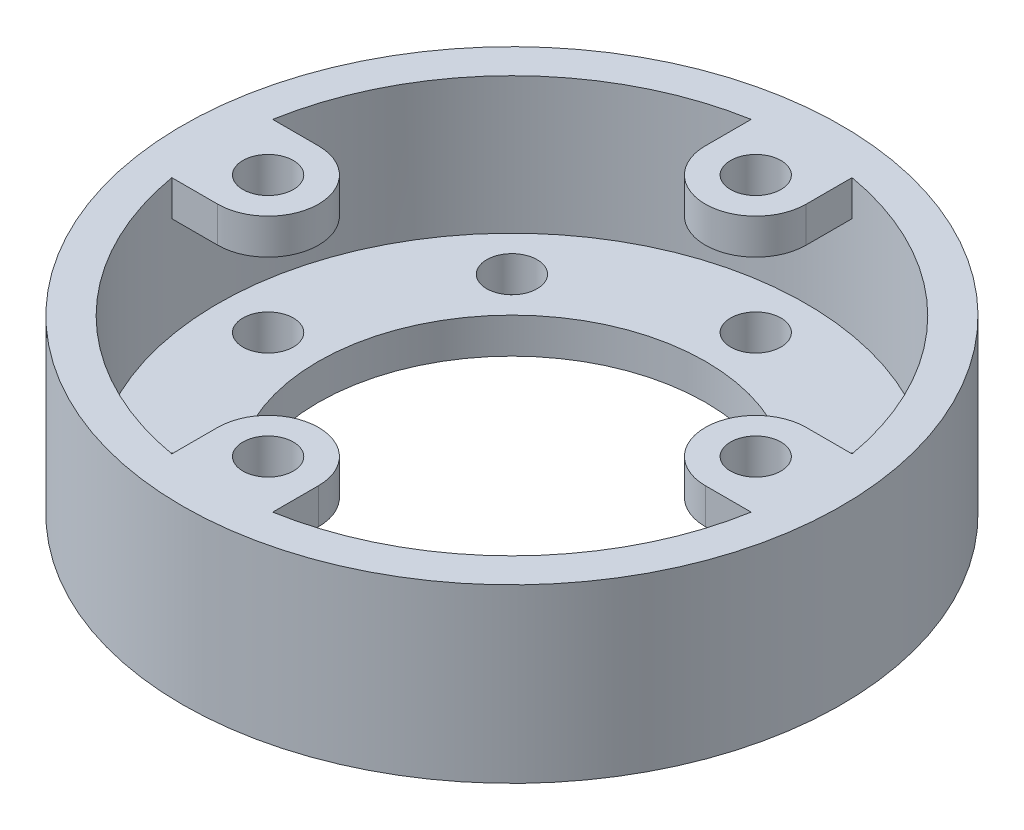
ISO-10303-21;
HEADER;
FILE_DESCRIPTION(('STEP AP214'),'2;1');
FILE_NAME('part.step','',(''),(''),'','','');
FILE_SCHEMA(('AUTOMOTIVE_DESIGN { 1 0 10303 214 1 1 1 1 }'));
ENDSEC;
DATA;
#1=APPLICATION_CONTEXT('core data for automotive mechanical design processes');
#2=APPLICATION_PROTOCOL_DEFINITION('international standard','automotive_design',2000,#1);
#3=PRODUCT_CONTEXT('',#1,'mechanical');
#4=PRODUCT('Part','Part','',(#3));
#5=PRODUCT_RELATED_PRODUCT_CATEGORY('part','',(#4));
#6=PRODUCT_DEFINITION_FORMATION('','',#4);
#7=PRODUCT_DEFINITION_CONTEXT('part definition',#1,'design');
#8=PRODUCT_DEFINITION('design','',#6,#7);
#9=PRODUCT_DEFINITION_SHAPE('','',#8);
#10=(LENGTH_UNIT() NAMED_UNIT(*) SI_UNIT(.MILLI.,.METRE.));
#11=(NAMED_UNIT(*) PLANE_ANGLE_UNIT() SI_UNIT($,.RADIAN.));
#12=(NAMED_UNIT(*) SI_UNIT($,.STERADIAN.) SOLID_ANGLE_UNIT());
#13=UNCERTAINTY_MEASURE_WITH_UNIT(LENGTH_MEASURE(1.E-05),#10,'distance_accuracy_value','');
#14=(GEOMETRIC_REPRESENTATION_CONTEXT(3) GLOBAL_UNCERTAINTY_ASSIGNED_CONTEXT((#13)) GLOBAL_UNIT_ASSIGNED_CONTEXT((#10,
#11,#12)) REPRESENTATION_CONTEXT('',''));
#15=CARTESIAN_POINT('',(0.,0.,0.));
#16=DIRECTION('',(0.,0.,1.));
#17=DIRECTION('',(1.,0.,0.));
#18=AXIS2_PLACEMENT_3D('',#15,#16,#17);
#19=CARTESIAN_POINT('',(0.,7.874,0.));
#20=DIRECTION('',(0.,1.,0.));
#21=DIRECTION('',(0.,0.,1.));
#22=AXIS2_PLACEMENT_3D('',#19,#20,#21);
#23=PLANE('',#22);
#24=CARTESIAN_POINT('',(-54.025277322763,7.874,0.));
#25=DIRECTION('',(0.,1.,0.));
#26=DIRECTION('',(0.,0.,1.));
#27=AXIS2_PLACEMENT_3D('',#24,#25,#26);
#28=CIRCLE('',#27,5.588);
#29=CARTESIAN_POINT('',(-54.025277322763,7.874,5.588));
#30=VERTEX_POINT('',#29);
#31=EDGE_CURVE('E338',#30,#30,#28,.T.);
#32=ORIENTED_EDGE('',*,*,#31,.F.);
#33=EDGE_LOOP('',(#32));
#34=FACE_BOUND('',#33,.T.);
#35=CARTESIAN_POINT('',(-38.2016399504095,7.874,-38.2016399504096));
#36=DIRECTION('',(0.,1.,0.));
#37=DIRECTION('',(0.,0.,1.));
#38=AXIS2_PLACEMENT_3D('',#35,#36,#37);
#39=CIRCLE('',#38,5.58799999999998);
#40=CARTESIAN_POINT('',(-38.2016399504095,7.874,-32.6136399504097));
#41=VERTEX_POINT('',#40);
#42=EDGE_CURVE('E342',#41,#41,#39,.T.);
#43=ORIENTED_EDGE('',*,*,#42,.F.);
#44=EDGE_LOOP('',(#43));
#45=FACE_BOUND('',#44,.T.);
#46=CARTESIAN_POINT('',(1.51354623278976E-13,7.874,-54.025277322763));
#47=DIRECTION('',(0.,1.,0.));
#48=DIRECTION('',(0.,0.,1.));
#49=AXIS2_PLACEMENT_3D('',#46,#47,#48);
#50=CIRCLE('',#49,5.588);
#51=CARTESIAN_POINT('',(1.51354623278976E-13,7.874,-48.437277322763));
#52=VERTEX_POINT('',#51);
#53=EDGE_CURVE('E346',#52,#52,#50,.T.);
#54=ORIENTED_EDGE('',*,*,#53,.F.);
#55=EDGE_LOOP('',(#54));
#56=FACE_BOUND('',#55,.T.);
#57=CARTESIAN_POINT('',(38.2016399504097,7.874,-38.2016399504094));
#58=DIRECTION('',(0.,1.,0.));
#59=DIRECTION('',(0.,0.,1.));
#60=AXIS2_PLACEMENT_3D('',#57,#58,#59);
#61=CIRCLE('',#60,5.588);
#62=CARTESIAN_POINT('',(38.2016399504097,7.874,-32.6136399504094));
#63=VERTEX_POINT('',#62);
#64=EDGE_CURVE('E350',#63,#63,#61,.T.);
#65=ORIENTED_EDGE('',*,*,#64,.F.);
#66=EDGE_LOOP('',(#65));
#67=FACE_BOUND('',#66,.T.);
#68=CARTESIAN_POINT('',(54.0252773227631,7.874,2.80157841370254E-13));
#69=DIRECTION('',(0.,1.,0.));
#70=DIRECTION('',(0.,0.,1.));
#71=AXIS2_PLACEMENT_3D('',#68,#69,#70);
#72=CIRCLE('',#71,5.588);
#73=CARTESIAN_POINT('',(54.0252773227631,7.874,5.58800000000028));
#74=VERTEX_POINT('',#73);
#75=EDGE_CURVE('E354',#74,#74,#72,.T.);
#76=ORIENTED_EDGE('',*,*,#75,.F.);
#77=EDGE_LOOP('',(#76));
#78=FACE_BOUND('',#77,.T.);
#79=CARTESIAN_POINT('',(38.2016399504093,7.874,38.2016399504098));
#80=DIRECTION('',(0.,1.,0.));
#81=DIRECTION('',(0.,0.,1.));
#82=AXIS2_PLACEMENT_3D('',#79,#80,#81);
#83=CIRCLE('',#82,5.588);
#84=CARTESIAN_POINT('',(38.2016399504093,7.874,43.7896399504098));
#85=VERTEX_POINT('',#84);
#86=EDGE_CURVE('E358',#85,#85,#83,.T.);
#87=ORIENTED_EDGE('',*,*,#86,.F.);
#88=EDGE_LOOP('',(#87));
#89=FACE_BOUND('',#88,.T.);
#90=CARTESIAN_POINT('',(-4.09828421199521E-13,7.874,54.025277322763));
#91=DIRECTION('',(0.,1.,0.));
#92=DIRECTION('',(0.,0.,1.));
#93=AXIS2_PLACEMENT_3D('',#90,#91,#92);
#94=CIRCLE('',#93,5.588);
#95=CARTESIAN_POINT('',(-4.09828421199521E-13,7.874,59.613277322763));
#96=VERTEX_POINT('',#95);
#97=EDGE_CURVE('E362',#96,#96,#94,.T.);
#98=ORIENTED_EDGE('',*,*,#97,.F.);
#99=EDGE_LOOP('',(#98));
#100=FACE_BOUND('',#99,.T.);
#101=CARTESIAN_POINT('',(-38.2016399504099,7.874,38.2016399504092));
#102=DIRECTION('',(0.,1.,0.));
#103=DIRECTION('',(0.,0.,1.));
#104=AXIS2_PLACEMENT_3D('',#101,#102,#103);
#105=CIRCLE('',#104,5.58800000000001);
#106=CARTESIAN_POINT('',(-38.2016399504099,7.874,43.7896399504092));
#107=VERTEX_POINT('',#106);
#108=EDGE_CURVE('E366',#107,#107,#105,.T.);
#109=ORIENTED_EDGE('',*,*,#108,.F.);
#110=EDGE_LOOP('',(#109));
#111=FACE_BOUND('',#110,.T.);
#112=CARTESIAN_POINT('',(0.,7.874,0.));
#113=DIRECTION('',(0.,1.,0.));
#114=DIRECTION('',(0.,0.,1.));
#115=AXIS2_PLACEMENT_3D('',#112,#113,#114);
#116=CIRCLE('',#115,42.926);
#117=CARTESIAN_POINT('',(0.,7.874,42.926));
#118=VERTEX_POINT('',#117);
#119=EDGE_CURVE('E303',#118,#118,#116,.T.);
#120=ORIENTED_EDGE('',*,*,#119,.F.);
#121=EDGE_LOOP('',(#120));
#122=FACE_BOUND('',#121,.T.);
#123=CARTESIAN_POINT('',(0.,7.874,0.));
#124=DIRECTION('',(0.,1.,0.));
#125=DIRECTION('',(0.,0.,1.));
#126=AXIS2_PLACEMENT_3D('',#123,#124,#125);
#127=CIRCLE('',#126,65.151);
#128=CARTESIAN_POINT('',(0.,7.874,65.151));
#129=VERTEX_POINT('',#128);
#130=EDGE_CURVE('E11',#129,#129,#127,.F.);
#131=ORIENTED_EDGE('',*,*,#130,.F.);
#132=EDGE_LOOP('',(#131));
#133=FACE_BOUND('',#132,.T.);
#134=ADVANCED_FACE('F35',(#34,#45,#56,#67,#78,#89,#100,#111,#122,#133),#23,.T.);
#135=CARTESIAN_POINT('',(0.,0.,0.));
#136=DIRECTION('',(0.,1.,0.));
#137=DIRECTION('',(0.,0.,1.));
#138=AXIS2_PLACEMENT_3D('',#135,#136,#137);
#139=PLANE('',#138);
#140=CARTESIAN_POINT('',(-54.025277322763,0.,0.));
#141=DIRECTION('',(0.,1.,0.));
#142=DIRECTION('',(0.,0.,1.));
#143=AXIS2_PLACEMENT_3D('',#140,#141,#142);
#144=CIRCLE('',#143,5.588);
#145=CARTESIAN_POINT('',(-54.025277322763,0.,5.588));
#146=VERTEX_POINT('',#145);
#147=EDGE_CURVE('E181',#146,#146,#144,.T.);
#148=ORIENTED_EDGE('',*,*,#147,.T.);
#149=EDGE_LOOP('',(#148));
#150=FACE_BOUND('',#149,.T.);
#151=CARTESIAN_POINT('',(-38.2016399504095,0.,-38.2016399504096));
#152=DIRECTION('',(0.,1.,0.));
#153=DIRECTION('',(0.,0.,1.));
#154=AXIS2_PLACEMENT_3D('',#151,#152,#153);
#155=CIRCLE('',#154,5.58799999999998);
#156=CARTESIAN_POINT('',(-38.2016399504095,0.,-32.6136399504097));
#157=VERTEX_POINT('',#156);
#158=EDGE_CURVE('E487',#157,#157,#155,.T.);
#159=ORIENTED_EDGE('',*,*,#158,.T.);
#160=EDGE_LOOP('',(#159));
#161=FACE_BOUND('',#160,.T.);
#162=CARTESIAN_POINT('',(1.51354623278976E-13,0.,-54.025277322763));
#163=DIRECTION('',(0.,1.,0.));
#164=DIRECTION('',(0.,0.,1.));
#165=AXIS2_PLACEMENT_3D('',#162,#163,#164);
#166=CIRCLE('',#165,5.588);
#167=CARTESIAN_POINT('',(1.51354623278976E-13,0.,-48.437277322763));
#168=VERTEX_POINT('',#167);
#169=EDGE_CURVE('E494',#168,#168,#166,.T.);
#170=ORIENTED_EDGE('',*,*,#169,.T.);
#171=EDGE_LOOP('',(#170));
#172=FACE_BOUND('',#171,.T.);
#173=CARTESIAN_POINT('',(38.2016399504097,0.,-38.2016399504094));
#174=DIRECTION('',(0.,1.,0.));
#175=DIRECTION('',(0.,0.,1.));
#176=AXIS2_PLACEMENT_3D('',#173,#174,#175);
#177=CIRCLE('',#176,5.588);
#178=CARTESIAN_POINT('',(38.2016399504097,0.,-32.6136399504094));
#179=VERTEX_POINT('',#178);
#180=EDGE_CURVE('E498',#179,#179,#177,.T.);
#181=ORIENTED_EDGE('',*,*,#180,.T.);
#182=EDGE_LOOP('',(#181));
#183=FACE_BOUND('',#182,.T.);
#184=CARTESIAN_POINT('',(54.0252773227631,0.,2.80157841370254E-13));
#185=DIRECTION('',(0.,1.,0.));
#186=DIRECTION('',(0.,0.,1.));
#187=AXIS2_PLACEMENT_3D('',#184,#185,#186);
#188=CIRCLE('',#187,5.588);
#189=CARTESIAN_POINT('',(54.0252773227631,0.,5.58800000000028));
#190=VERTEX_POINT('',#189);
#191=EDGE_CURVE('E502',#190,#190,#188,.T.);
#192=ORIENTED_EDGE('',*,*,#191,.T.);
#193=EDGE_LOOP('',(#192));
#194=FACE_BOUND('',#193,.T.);
#195=CARTESIAN_POINT('',(38.2016399504093,0.,38.2016399504098));
#196=DIRECTION('',(0.,1.,0.));
#197=DIRECTION('',(0.,0.,1.));
#198=AXIS2_PLACEMENT_3D('',#195,#196,#197);
#199=CIRCLE('',#198,5.588);
#200=CARTESIAN_POINT('',(38.2016399504093,0.,43.7896399504098));
#201=VERTEX_POINT('',#200);
#202=EDGE_CURVE('E506',#201,#201,#199,.T.);
#203=ORIENTED_EDGE('',*,*,#202,.T.);
#204=EDGE_LOOP('',(#203));
#205=FACE_BOUND('',#204,.T.);
#206=CARTESIAN_POINT('',(-4.09828421199521E-13,0.,54.025277322763));
#207=DIRECTION('',(0.,1.,0.));
#208=DIRECTION('',(0.,0.,1.));
#209=AXIS2_PLACEMENT_3D('',#206,#207,#208);
#210=CIRCLE('',#209,5.588);
#211=CARTESIAN_POINT('',(-4.09828421199521E-13,0.,59.613277322763));
#212=VERTEX_POINT('',#211);
#213=EDGE_CURVE('E510',#212,#212,#210,.T.);
#214=ORIENTED_EDGE('',*,*,#213,.T.);
#215=EDGE_LOOP('',(#214));
#216=FACE_BOUND('',#215,.T.);
#217=CARTESIAN_POINT('',(-38.2016399504099,0.,38.2016399504092));
#218=DIRECTION('',(0.,1.,0.));
#219=DIRECTION('',(0.,0.,1.));
#220=AXIS2_PLACEMENT_3D('',#217,#218,#219);
#221=CIRCLE('',#220,5.58800000000001);
#222=CARTESIAN_POINT('',(-38.2016399504099,0.,43.7896399504092));
#223=VERTEX_POINT('',#222);
#224=EDGE_CURVE('E514',#223,#223,#221,.T.);
#225=ORIENTED_EDGE('',*,*,#224,.T.);
#226=EDGE_LOOP('',(#225));
#227=FACE_BOUND('',#226,.T.);
#228=CARTESIAN_POINT('',(0.,0.,0.));
#229=DIRECTION('',(0.,1.,0.));
#230=DIRECTION('',(0.,0.,1.));
#231=AXIS2_PLACEMENT_3D('',#228,#229,#230);
#232=CIRCLE('',#231,73.025);
#233=CARTESIAN_POINT('',(0.,0.,73.025));
#234=VERTEX_POINT('',#233);
#235=EDGE_CURVE('E43',#234,#234,#232,.T.);
#236=ORIENTED_EDGE('',*,*,#235,.F.);
#237=EDGE_LOOP('',(#236));
#238=FACE_BOUND('',#237,.T.);
#239=CARTESIAN_POINT('',(0.,0.,0.));
#240=DIRECTION('',(0.,1.,0.));
#241=DIRECTION('',(0.,0.,1.));
#242=AXIS2_PLACEMENT_3D('',#239,#240,#241);
#243=CIRCLE('',#242,42.926);
#244=CARTESIAN_POINT('',(0.,0.,42.926));
#245=VERTEX_POINT('',#244);
#246=EDGE_CURVE('E302',#245,#245,#243,.T.);
#247=ORIENTED_EDGE('',*,*,#246,.T.);
#248=EDGE_LOOP('',(#247));
#249=FACE_BOUND('',#248,.T.);
#250=ADVANCED_FACE('F312',(#150,#161,#172,#183,#194,#205,#216,#227,#238,#249),#139,.F.);
#251=CARTESIAN_POINT('',(0.,7.874,0.));
#252=DIRECTION('',(0.,-1.,0.));
#253=DIRECTION('',(0.,0.,-1.));
#254=AXIS2_PLACEMENT_3D('',#251,#252,#253);
#255=CYLINDRICAL_SURFACE('',#254,73.025);
#256=ORIENTED_EDGE('',*,*,#235,.T.);
#257=EDGE_LOOP('',(#256));
#258=FACE_BOUND('',#257,.T.);
#259=CARTESIAN_POINT('',(0.,38.1,0.));
#260=DIRECTION('',(0.,1.,0.));
#261=DIRECTION('',(0.,0.,1.));
#262=AXIS2_PLACEMENT_3D('',#259,#260,#261);
#263=CIRCLE('',#262,73.025);
#264=CARTESIAN_POINT('',(0.,38.1,73.025));
#265=VERTEX_POINT('',#264);
#266=EDGE_CURVE('E298',#265,#265,#263,.T.);
#267=ORIENTED_EDGE('',*,*,#266,.F.);
#268=EDGE_LOOP('',(#267));
#269=FACE_BOUND('',#268,.T.);
#270=ADVANCED_FACE('F37',(#258,#269),#255,.T.);
#271=CARTESIAN_POINT('',(0.,7.874,0.));
#272=DIRECTION('',(0.,-1.,0.));
#273=DIRECTION('',(0.,0.,-1.));
#274=AXIS2_PLACEMENT_3D('',#271,#272,#273);
#275=CYLINDRICAL_SURFACE('',#274,42.926);
#276=ORIENTED_EDGE('',*,*,#119,.T.);
#277=EDGE_LOOP('',(#276));
#278=FACE_BOUND('',#277,.T.);
#279=ORIENTED_EDGE('',*,*,#246,.F.);
#280=EDGE_LOOP('',(#279));
#281=FACE_BOUND('',#280,.T.);
#282=ADVANCED_FACE('F318',(#278,#281),#275,.F.);
#283=CARTESIAN_POINT('',(0.,38.1,0.));
#284=DIRECTION('',(0.,1.,0.));
#285=DIRECTION('',(0.,0.,1.));
#286=AXIS2_PLACEMENT_3D('',#283,#284,#285);
#287=PLANE('',#286);
#288=ORIENTED_EDGE('',*,*,#266,.T.);
#289=EDGE_LOOP('',(#288));
#290=FACE_BOUND('',#289,.T.);
#291=CARTESIAN_POINT('',(0.,38.1,0.));
#292=DIRECTION('',(0.,1.,0.));
#293=DIRECTION('',(0.,0.,1.));
#294=AXIS2_PLACEMENT_3D('',#291,#292,#293);
#295=CIRCLE('',#294,65.151);
#296=CARTESIAN_POINT('',(-64.185277322763,38.1,11.176));
#297=VERTEX_POINT('',#296);
#298=CARTESIAN_POINT('',(-11.176,38.1,64.185277322763));
#299=VERTEX_POINT('',#298);
#300=EDGE_CURVE('E296',#297,#299,#295,.T.);
#301=ORIENTED_EDGE('',*,*,#300,.F.);
#302=DIRECTION('',(1.,0.,0.));
#303=VECTOR('',#302,1.);
#304=CARTESIAN_POINT('',(0.,38.1,11.176));
#305=LINE('',#304,#303);
#306=CARTESIAN_POINT('',(-54.025277322763,38.1,11.176));
#307=VERTEX_POINT('',#306);
#308=EDGE_CURVE('E265',#297,#307,#305,.T.);
#309=ORIENTED_EDGE('',*,*,#308,.T.);
#310=CARTESIAN_POINT('',(-54.025277322763,38.1,0.));
#311=DIRECTION('',(0.,1.,0.));
#312=DIRECTION('',(0.,0.,1.));
#313=AXIS2_PLACEMENT_3D('',#310,#311,#312);
#314=CIRCLE('',#313,11.176);
#315=CARTESIAN_POINT('',(-54.025277322763,38.1,-11.176));
#316=VERTEX_POINT('',#315);
#317=EDGE_CURVE('E278',#316,#307,#314,.F.);
#318=ORIENTED_EDGE('',*,*,#317,.F.);
#319=DIRECTION('',(1.,0.,0.));
#320=VECTOR('',#319,1.);
#321=CARTESIAN_POINT('',(0.,38.1,-11.176));
#322=LINE('',#321,#320);
#323=CARTESIAN_POINT('',(-64.185277322763,38.1,-11.176));
#324=VERTEX_POINT('',#323);
#325=EDGE_CURVE('E281',#324,#316,#322,.T.);
#326=ORIENTED_EDGE('',*,*,#325,.F.);
#327=CARTESIAN_POINT('',(-11.176,38.1,-64.185277322763));
#328=VERTEX_POINT('',#327);
#329=EDGE_CURVE('E287',#328,#324,#295,.T.);
#330=ORIENTED_EDGE('',*,*,#329,.F.);
#331=DIRECTION('',(0.,0.,1.));
#332=VECTOR('',#331,1.);
#333=CARTESIAN_POINT('',(-11.176,38.1,0.));
#334=LINE('',#333,#332);
#335=CARTESIAN_POINT('',(-11.176,38.1,-54.025277322763));
#336=VERTEX_POINT('',#335);
#337=EDGE_CURVE('E230',#328,#336,#334,.T.);
#338=ORIENTED_EDGE('',*,*,#337,.T.);
#339=CARTESIAN_POINT('',(0.,38.1,-54.025277322763));
#340=DIRECTION('',(0.,1.,0.));
#341=DIRECTION('',(0.,0.,1.));
#342=AXIS2_PLACEMENT_3D('',#339,#340,#341);
#343=CIRCLE('',#342,11.176);
#344=CARTESIAN_POINT('',(11.176,38.1,-54.025277322763));
#345=VERTEX_POINT('',#344);
#346=EDGE_CURVE('E243',#345,#336,#343,.F.);
#347=ORIENTED_EDGE('',*,*,#346,.F.);
#348=DIRECTION('',(0.,0.,1.));
#349=VECTOR('',#348,1.);
#350=CARTESIAN_POINT('',(11.176,38.1,0.));
#351=LINE('',#350,#349);
#352=CARTESIAN_POINT('',(11.176,38.1,-64.185277322763));
#353=VERTEX_POINT('',#352);
#354=EDGE_CURVE('E246',#353,#345,#351,.T.);
#355=ORIENTED_EDGE('',*,*,#354,.F.);
#356=CARTESIAN_POINT('',(64.1852773227628,38.1,-11.1760000000012));
#357=VERTEX_POINT('',#356);
#358=EDGE_CURVE('E757',#357,#353,#295,.T.);
#359=ORIENTED_EDGE('',*,*,#358,.F.);
#360=DIRECTION('',(-1.,0.,0.));
#361=VECTOR('',#360,1.);
#362=CARTESIAN_POINT('',(0.,38.1,-11.1760000000012));
#363=LINE('',#362,#361);
#364=CARTESIAN_POINT('',(54.0252773227619,38.1,-11.1760000000012));
#365=VERTEX_POINT('',#364);
#366=EDGE_CURVE('E195',#357,#365,#363,.T.);
#367=ORIENTED_EDGE('',*,*,#366,.T.);
#368=CARTESIAN_POINT('',(54.0252773227619,38.1,-1.20094063229014E-12));
#369=DIRECTION('',(0.,1.,0.));
#370=DIRECTION('',(0.,0.,1.));
#371=AXIS2_PLACEMENT_3D('',#368,#369,#370);
#372=CIRCLE('',#371,11.176);
#373=CARTESIAN_POINT('',(54.0252773227619,38.1,11.1759999999988));
#374=VERTEX_POINT('',#373);
#375=EDGE_CURVE('E208',#374,#365,#372,.F.);
#376=ORIENTED_EDGE('',*,*,#375,.F.);
#377=DIRECTION('',(-1.,0.,0.));
#378=VECTOR('',#377,1.);
#379=CARTESIAN_POINT('',(0.,38.1,11.1759999999988));
#380=LINE('',#379,#378);
#381=CARTESIAN_POINT('',(64.1852773227632,38.1,11.1759999999988));
#382=VERTEX_POINT('',#381);
#383=EDGE_CURVE('E211',#382,#374,#380,.T.);
#384=ORIENTED_EDGE('',*,*,#383,.F.);
#385=CARTESIAN_POINT('',(11.176,38.1,64.185277322763));
#386=VERTEX_POINT('',#385);
#387=EDGE_CURVE('E299',#386,#382,#295,.T.);
#388=ORIENTED_EDGE('',*,*,#387,.F.);
#389=DIRECTION('',(0.,0.,-1.));
#390=VECTOR('',#389,1.);
#391=CARTESIAN_POINT('',(11.176,38.1,0.));
#392=LINE('',#391,#390);
#393=CARTESIAN_POINT('',(11.176,38.1,54.025277322763));
#394=VERTEX_POINT('',#393);
#395=EDGE_CURVE('E171',#386,#394,#392,.T.);
#396=ORIENTED_EDGE('',*,*,#395,.T.);
#397=CARTESIAN_POINT('',(0.,38.1,54.025277322763));
#398=DIRECTION('',(0.,1.,0.));
#399=DIRECTION('',(0.,0.,1.));
#400=AXIS2_PLACEMENT_3D('',#397,#398,#399);
#401=CIRCLE('',#400,11.176);
#402=CARTESIAN_POINT('',(-11.176,38.1,54.025277322763));
#403=VERTEX_POINT('',#402);
#404=EDGE_CURVE('E180',#403,#394,#401,.F.);
#405=ORIENTED_EDGE('',*,*,#404,.F.);
#406=DIRECTION('',(0.,0.,-1.));
#407=VECTOR('',#406,1.);
#408=CARTESIAN_POINT('',(-11.176,38.1,0.));
#409=LINE('',#408,#407);
#410=EDGE_CURVE('E159',#299,#403,#409,.T.);
#411=ORIENTED_EDGE('',*,*,#410,.F.);
#412=EDGE_LOOP('',(#301,#309,#318,#326,#330,#338,#347,#355,#359,#367,#376,#384,#388,#396,#405,#411));
#413=FACE_BOUND('',#412,.T.);
#414=CARTESIAN_POINT('',(-54.025277322763,38.1,0.));
#415=DIRECTION('',(0.,1.,0.));
#416=DIRECTION('',(0.,0.,1.));
#417=AXIS2_PLACEMENT_3D('',#414,#415,#416);
#418=CIRCLE('',#417,5.588);
#419=CARTESIAN_POINT('',(-54.025277322763,38.1,5.588));
#420=VERTEX_POINT('',#419);
#421=EDGE_CURVE('E252',#420,#420,#418,.T.);
#422=ORIENTED_EDGE('',*,*,#421,.F.);
#423=EDGE_LOOP('',(#422));
#424=FACE_BOUND('',#423,.T.);
#425=CARTESIAN_POINT('',(0.,38.1,-54.025277322763));
#426=DIRECTION('',(0.,1.,0.));
#427=DIRECTION('',(0.,0.,1.));
#428=AXIS2_PLACEMENT_3D('',#425,#426,#427);
#429=CIRCLE('',#428,5.58800000000006);
#430=CARTESIAN_POINT('',(0.,38.1,-48.437277322763));
#431=VERTEX_POINT('',#430);
#432=EDGE_CURVE('E217',#431,#431,#429,.T.);
#433=ORIENTED_EDGE('',*,*,#432,.F.);
#434=EDGE_LOOP('',(#433));
#435=FACE_BOUND('',#434,.T.);
#436=CARTESIAN_POINT('',(54.0252773227619,38.1,-1.20094063229014E-12));
#437=DIRECTION('',(0.,1.,0.));
#438=DIRECTION('',(0.,0.,1.));
#439=AXIS2_PLACEMENT_3D('',#436,#437,#438);
#440=CIRCLE('',#439,5.58799999999934);
#441=CARTESIAN_POINT('',(54.0252773227619,38.1,5.58799999999813));
#442=VERTEX_POINT('',#441);
#443=EDGE_CURVE('E187',#442,#442,#440,.T.);
#444=ORIENTED_EDGE('',*,*,#443,.F.);
#445=EDGE_LOOP('',(#444));
#446=FACE_BOUND('',#445,.T.);
#447=CARTESIAN_POINT('',(0.,38.1,54.025277322763));
#448=DIRECTION('',(0.,1.,0.));
#449=DIRECTION('',(0.,0.,1.));
#450=AXIS2_PLACEMENT_3D('',#447,#448,#449);
#451=CIRCLE('',#450,5.58800000000012);
#452=CARTESIAN_POINT('',(0.,38.1,59.6132773227631));
#453=VERTEX_POINT('',#452);
#454=EDGE_CURVE('E177',#453,#453,#451,.T.);
#455=ORIENTED_EDGE('',*,*,#454,.F.);
#456=EDGE_LOOP('',(#455));
#457=FACE_BOUND('',#456,.T.);
#458=ADVANCED_FACE('F320',(#290,#413,#424,#435,#446,#457),#287,.T.);
#459=CARTESIAN_POINT('',(0.,38.1,0.));
#460=DIRECTION('',(0.,-1.,0.));
#461=DIRECTION('',(0.,0.,-1.));
#462=AXIS2_PLACEMENT_3D('',#459,#460,#461);
#463=CYLINDRICAL_SURFACE('',#462,65.151);
#464=DIRECTION('',(0.,1.,0.));
#465=VECTOR('',#464,1.);
#466=CARTESIAN_POINT('',(11.176,30.226,64.185277322763));
#467=LINE('',#466,#465);
#468=CARTESIAN_POINT('',(11.176,30.226,64.185277322763));
#469=VERTEX_POINT('',#468);
#470=EDGE_CURVE('E188',#469,#386,#467,.T.);
#471=ORIENTED_EDGE('',*,*,#470,.T.);
#472=ORIENTED_EDGE('',*,*,#387,.T.);
#473=DIRECTION('',(0.,1.,0.));
#474=VECTOR('',#473,1.);
#475=CARTESIAN_POINT('',(64.1852773227632,30.226,11.1759999999988));
#476=LINE('',#475,#474);
#477=CARTESIAN_POINT('',(64.1852773227632,30.226,11.1759999999988));
#478=VERTEX_POINT('',#477);
#479=EDGE_CURVE('E221',#478,#382,#476,.T.);
#480=ORIENTED_EDGE('',*,*,#479,.F.);
#481=CARTESIAN_POINT('',(0.,30.226,0.));
#482=DIRECTION('',(0.,1.,0.));
#483=DIRECTION('',(0.,0.,1.));
#484=AXIS2_PLACEMENT_3D('',#481,#482,#483);
#485=CIRCLE('',#484,65.151);
#486=CARTESIAN_POINT('',(64.1852773227628,30.226,-11.1760000000012));
#487=VERTEX_POINT('',#486);
#488=EDGE_CURVE('E199',#487,#478,#485,.F.);
#489=ORIENTED_EDGE('',*,*,#488,.F.);
#490=DIRECTION('',(0.,1.,0.));
#491=VECTOR('',#490,1.);
#492=CARTESIAN_POINT('',(64.1852773227628,30.226,-11.1760000000012));
#493=LINE('',#492,#491);
#494=EDGE_CURVE('E218',#487,#357,#493,.T.);
#495=ORIENTED_EDGE('',*,*,#494,.T.);
#496=ORIENTED_EDGE('',*,*,#358,.T.);
#497=DIRECTION('',(0.,1.,0.));
#498=VECTOR('',#497,1.);
#499=CARTESIAN_POINT('',(11.176,30.226,-64.185277322763));
#500=LINE('',#499,#498);
#501=CARTESIAN_POINT('',(11.176,30.226,-64.185277322763));
#502=VERTEX_POINT('',#501);
#503=EDGE_CURVE('E256',#502,#353,#500,.T.);
#504=ORIENTED_EDGE('',*,*,#503,.F.);
#505=CARTESIAN_POINT('',(0.,30.226,0.));
#506=DIRECTION('',(0.,1.,0.));
#507=DIRECTION('',(0.,0.,1.));
#508=AXIS2_PLACEMENT_3D('',#505,#506,#507);
#509=CIRCLE('',#508,65.151);
#510=CARTESIAN_POINT('',(-11.176,30.226,-64.185277322763));
#511=VERTEX_POINT('',#510);
#512=EDGE_CURVE('E234',#511,#502,#509,.F.);
#513=ORIENTED_EDGE('',*,*,#512,.F.);
#514=DIRECTION('',(0.,1.,0.));
#515=VECTOR('',#514,1.);
#516=CARTESIAN_POINT('',(-11.176,30.226,-64.185277322763));
#517=LINE('',#516,#515);
#518=EDGE_CURVE('E253',#511,#328,#517,.T.);
#519=ORIENTED_EDGE('',*,*,#518,.T.);
#520=ORIENTED_EDGE('',*,*,#329,.T.);
#521=DIRECTION('',(0.,1.,0.));
#522=VECTOR('',#521,1.);
#523=CARTESIAN_POINT('',(-64.185277322763,30.226,-11.176));
#524=LINE('',#523,#522);
#525=CARTESIAN_POINT('',(-64.185277322763,30.226,-11.176));
#526=VERTEX_POINT('',#525);
#527=EDGE_CURVE('E291',#526,#324,#524,.T.);
#528=ORIENTED_EDGE('',*,*,#527,.F.);
#529=CARTESIAN_POINT('',(0.,30.226,0.));
#530=DIRECTION('',(0.,1.,0.));
#531=DIRECTION('',(0.,0.,1.));
#532=AXIS2_PLACEMENT_3D('',#529,#530,#531);
#533=CIRCLE('',#532,65.151);
#534=CARTESIAN_POINT('',(-64.185277322763,30.226,11.176));
#535=VERTEX_POINT('',#534);
#536=EDGE_CURVE('E269',#535,#526,#533,.F.);
#537=ORIENTED_EDGE('',*,*,#536,.F.);
#538=DIRECTION('',(0.,1.,0.));
#539=VECTOR('',#538,1.);
#540=CARTESIAN_POINT('',(-64.185277322763,30.226,11.176));
#541=LINE('',#540,#539);
#542=EDGE_CURVE('E288',#535,#297,#541,.T.);
#543=ORIENTED_EDGE('',*,*,#542,.T.);
#544=ORIENTED_EDGE('',*,*,#300,.T.);
#545=DIRECTION('',(0.,1.,0.));
#546=VECTOR('',#545,1.);
#547=CARTESIAN_POINT('',(-11.176,30.226,64.185277322763));
#548=LINE('',#547,#546);
#549=CARTESIAN_POINT('',(-11.176,30.226,64.185277322763));
#550=VERTEX_POINT('',#549);
#551=EDGE_CURVE('E55',#550,#299,#548,.T.);
#552=ORIENTED_EDGE('',*,*,#551,.F.);
#553=CARTESIAN_POINT('',(0.,30.226,0.));
#554=DIRECTION('',(0.,1.,0.));
#555=DIRECTION('',(0.,0.,1.));
#556=AXIS2_PLACEMENT_3D('',#553,#554,#555);
#557=CIRCLE('',#556,65.151);
#558=EDGE_CURVE('E50',#469,#550,#557,.F.);
#559=ORIENTED_EDGE('',*,*,#558,.F.);
#560=EDGE_LOOP('',(#471,#472,#480,#489,#495,#496,#504,#513,#519,#520,#528,#537,#543,#544,#552,#559));
#561=FACE_BOUND('',#560,.T.);
#562=ORIENTED_EDGE('',*,*,#130,.T.);
#563=EDGE_LOOP('',(#562));
#564=FACE_BOUND('',#563,.T.);
#565=ADVANCED_FACE('F327',(#561,#564),#463,.F.);
#566=CARTESIAN_POINT('',(-54.025277322763,30.226,0.));
#567=DIRECTION('',(0.,1.,0.));
#568=DIRECTION('',(0.,0.,1.));
#569=AXIS2_PLACEMENT_3D('',#566,#567,#568);
#570=CYLINDRICAL_SURFACE('',#569,11.176);
#571=ORIENTED_EDGE('',*,*,#317,.T.);
#572=DIRECTION('',(0.,1.,0.));
#573=VECTOR('',#572,1.);
#574=CARTESIAN_POINT('',(-54.025277322763,30.226,11.176));
#575=LINE('',#574,#573);
#576=CARTESIAN_POINT('',(-54.025277322763,30.226,11.176));
#577=VERTEX_POINT('',#576);
#578=EDGE_CURVE('E285',#577,#307,#575,.T.);
#579=ORIENTED_EDGE('',*,*,#578,.F.);
#580=CARTESIAN_POINT('',(-54.025277322763,30.226,0.));
#581=DIRECTION('',(0.,1.,0.));
#582=DIRECTION('',(0.,0.,1.));
#583=AXIS2_PLACEMENT_3D('',#580,#581,#582);
#584=CIRCLE('',#583,11.176);
#585=CARTESIAN_POINT('',(-54.025277322763,30.226,-11.176));
#586=VERTEX_POINT('',#585);
#587=EDGE_CURVE('E264',#586,#577,#584,.F.);
#588=ORIENTED_EDGE('',*,*,#587,.F.);
#589=DIRECTION('',(0.,1.,0.));
#590=VECTOR('',#589,1.);
#591=CARTESIAN_POINT('',(-54.025277322763,30.226,-11.176));
#592=LINE('',#591,#590);
#593=EDGE_CURVE('E275',#586,#316,#592,.T.);
#594=ORIENTED_EDGE('',*,*,#593,.T.);
#595=EDGE_LOOP('',(#571,#579,#588,#594));
#596=FACE_BOUND('',#595,.T.);
#597=ADVANCED_FACE('F372',(#596),#570,.T.);
#598=CARTESIAN_POINT('',(0.,30.226,11.176));
#599=DIRECTION('',(0.,0.,1.));
#600=DIRECTION('',(1.,0.,0.));
#601=AXIS2_PLACEMENT_3D('',#598,#599,#600);
#602=PLANE('',#601);
#603=ORIENTED_EDGE('',*,*,#308,.F.);
#604=ORIENTED_EDGE('',*,*,#542,.F.);
#605=DIRECTION('',(1.,0.,0.));
#606=VECTOR('',#605,1.);
#607=CARTESIAN_POINT('',(0.,30.226,11.176));
#608=LINE('',#607,#606);
#609=EDGE_CURVE('E272',#535,#577,#608,.T.);
#610=ORIENTED_EDGE('',*,*,#609,.T.);
#611=ORIENTED_EDGE('',*,*,#578,.T.);
#612=EDGE_LOOP('',(#603,#604,#610,#611));
#613=FACE_BOUND('',#612,.T.);
#614=ADVANCED_FACE('F377',(#613),#602,.T.);
#615=CARTESIAN_POINT('',(-54.025277322763,30.226,0.));
#616=DIRECTION('',(0.,1.,0.));
#617=DIRECTION('',(0.,0.,1.));
#618=AXIS2_PLACEMENT_3D('',#615,#616,#617);
#619=CYLINDRICAL_SURFACE('',#618,5.588);
#620=CARTESIAN_POINT('',(-54.025277322763,30.226,0.));
#621=DIRECTION('',(0.,1.,0.));
#622=DIRECTION('',(0.,0.,1.));
#623=AXIS2_PLACEMENT_3D('',#620,#621,#622);
#624=CIRCLE('',#623,5.588);
#625=CARTESIAN_POINT('',(-54.025277322763,30.226,5.588));
#626=VERTEX_POINT('',#625);
#627=EDGE_CURVE('E261',#626,#626,#624,.T.);
#628=ORIENTED_EDGE('',*,*,#627,.F.);
#629=EDGE_LOOP('',(#628));
#630=FACE_BOUND('',#629,.T.);
#631=ORIENTED_EDGE('',*,*,#421,.T.);
#632=EDGE_LOOP('',(#631));
#633=FACE_BOUND('',#632,.T.);
#634=ADVANCED_FACE('F381',(#630,#633),#619,.F.);
#635=CARTESIAN_POINT('',(0.,30.226,-11.176));
#636=DIRECTION('',(0.,0.,1.));
#637=DIRECTION('',(1.,0.,0.));
#638=AXIS2_PLACEMENT_3D('',#635,#636,#637);
#639=PLANE('',#638);
#640=ORIENTED_EDGE('',*,*,#325,.T.);
#641=ORIENTED_EDGE('',*,*,#593,.F.);
#642=DIRECTION('',(1.,0.,0.));
#643=VECTOR('',#642,1.);
#644=CARTESIAN_POINT('',(0.,30.226,-11.176));
#645=LINE('',#644,#643);
#646=EDGE_CURVE('E267',#526,#586,#645,.T.);
#647=ORIENTED_EDGE('',*,*,#646,.F.);
#648=ORIENTED_EDGE('',*,*,#527,.T.);
#649=EDGE_LOOP('',(#640,#641,#647,#648));
#650=FACE_BOUND('',#649,.T.);
#651=ADVANCED_FACE('F383',(#650),#639,.F.);
#652=CARTESIAN_POINT('',(0.,30.226,0.));
#653=DIRECTION('',(0.,1.,0.));
#654=DIRECTION('',(0.,0.,1.));
#655=AXIS2_PLACEMENT_3D('',#652,#653,#654);
#656=PLANE('',#655);
#657=ORIENTED_EDGE('',*,*,#627,.T.);
#658=EDGE_LOOP('',(#657));
#659=FACE_BOUND('',#658,.T.);
#660=ORIENTED_EDGE('',*,*,#587,.T.);
#661=ORIENTED_EDGE('',*,*,#609,.F.);
#662=ORIENTED_EDGE('',*,*,#536,.T.);
#663=ORIENTED_EDGE('',*,*,#646,.T.);
#664=EDGE_LOOP('',(#660,#661,#662,#663));
#665=FACE_BOUND('',#664,.T.);
#666=ADVANCED_FACE('F388',(#659,#665),#656,.F.);
#667=CARTESIAN_POINT('',(0.,30.226,-54.025277322763));
#668=DIRECTION('',(0.,1.,0.));
#669=DIRECTION('',(0.,0.,1.));
#670=AXIS2_PLACEMENT_3D('',#667,#668,#669);
#671=CYLINDRICAL_SURFACE('',#670,11.176);
#672=ORIENTED_EDGE('',*,*,#346,.T.);
#673=DIRECTION('',(0.,1.,0.));
#674=VECTOR('',#673,1.);
#675=CARTESIAN_POINT('',(-11.176,30.226,-54.025277322763));
#676=LINE('',#675,#674);
#677=CARTESIAN_POINT('',(-11.176,30.226,-54.025277322763));
#678=VERTEX_POINT('',#677);
#679=EDGE_CURVE('E250',#678,#336,#676,.T.);
#680=ORIENTED_EDGE('',*,*,#679,.F.);
#681=CARTESIAN_POINT('',(0.,30.226,-54.025277322763));
#682=DIRECTION('',(0.,1.,0.));
#683=DIRECTION('',(0.,0.,1.));
#684=AXIS2_PLACEMENT_3D('',#681,#682,#683);
#685=CIRCLE('',#684,11.176);
#686=CARTESIAN_POINT('',(11.176,30.226,-54.025277322763));
#687=VERTEX_POINT('',#686);
#688=EDGE_CURVE('E229',#687,#678,#685,.F.);
#689=ORIENTED_EDGE('',*,*,#688,.F.);
#690=DIRECTION('',(0.,1.,0.));
#691=VECTOR('',#690,1.);
#692=CARTESIAN_POINT('',(11.176,30.226,-54.025277322763));
#693=LINE('',#692,#691);
#694=EDGE_CURVE('E240',#687,#345,#693,.T.);
#695=ORIENTED_EDGE('',*,*,#694,.T.);
#696=EDGE_LOOP('',(#672,#680,#689,#695));
#697=FACE_BOUND('',#696,.T.);
#698=ADVANCED_FACE('F395',(#697),#671,.T.);
#699=CARTESIAN_POINT('',(-11.176,30.226,0.));
#700=DIRECTION('',(-1.,0.,0.));
#701=DIRECTION('',(0.,0.,1.));
#702=AXIS2_PLACEMENT_3D('',#699,#700,#701);
#703=PLANE('',#702);
#704=ORIENTED_EDGE('',*,*,#337,.F.);
#705=ORIENTED_EDGE('',*,*,#518,.F.);
#706=DIRECTION('',(0.,0.,1.));
#707=VECTOR('',#706,1.);
#708=CARTESIAN_POINT('',(-11.176,30.226,0.));
#709=LINE('',#708,#707);
#710=EDGE_CURVE('E237',#511,#678,#709,.T.);
#711=ORIENTED_EDGE('',*,*,#710,.T.);
#712=ORIENTED_EDGE('',*,*,#679,.T.);
#713=EDGE_LOOP('',(#704,#705,#711,#712));
#714=FACE_BOUND('',#713,.T.);
#715=ADVANCED_FACE('F401',(#714),#703,.T.);
#716=CARTESIAN_POINT('',(0.,30.226,-54.025277322763));
#717=DIRECTION('',(0.,1.,0.));
#718=DIRECTION('',(0.,0.,1.));
#719=AXIS2_PLACEMENT_3D('',#716,#717,#718);
#720=CYLINDRICAL_SURFACE('',#719,5.58800000000006);
#721=CARTESIAN_POINT('',(0.,30.226,-54.025277322763));
#722=DIRECTION('',(0.,1.,0.));
#723=DIRECTION('',(0.,0.,1.));
#724=AXIS2_PLACEMENT_3D('',#721,#722,#723);
#725=CIRCLE('',#724,5.58800000000006);
#726=CARTESIAN_POINT('',(0.,30.226,-48.437277322763));
#727=VERTEX_POINT('',#726);
#728=EDGE_CURVE('E226',#727,#727,#725,.T.);
#729=ORIENTED_EDGE('',*,*,#728,.F.);
#730=EDGE_LOOP('',(#729));
#731=FACE_BOUND('',#730,.T.);
#732=ORIENTED_EDGE('',*,*,#432,.T.);
#733=EDGE_LOOP('',(#732));
#734=FACE_BOUND('',#733,.T.);
#735=ADVANCED_FACE('F397',(#731,#734),#720,.F.);
#736=CARTESIAN_POINT('',(11.176,30.226,0.));
#737=DIRECTION('',(-1.,0.,0.));
#738=DIRECTION('',(0.,0.,1.));
#739=AXIS2_PLACEMENT_3D('',#736,#737,#738);
#740=PLANE('',#739);
#741=ORIENTED_EDGE('',*,*,#354,.T.);
#742=ORIENTED_EDGE('',*,*,#694,.F.);
#743=DIRECTION('',(0.,0.,1.));
#744=VECTOR('',#743,1.);
#745=CARTESIAN_POINT('',(11.176,30.226,0.));
#746=LINE('',#745,#744);
#747=EDGE_CURVE('E232',#502,#687,#746,.T.);
#748=ORIENTED_EDGE('',*,*,#747,.F.);
#749=ORIENTED_EDGE('',*,*,#503,.T.);
#750=EDGE_LOOP('',(#741,#742,#748,#749));
#751=FACE_BOUND('',#750,.T.);
#752=ADVANCED_FACE('F400',(#751),#740,.F.);
#753=CARTESIAN_POINT('',(0.,30.226,0.));
#754=DIRECTION('',(0.,1.,0.));
#755=DIRECTION('',(0.,0.,1.));
#756=AXIS2_PLACEMENT_3D('',#753,#754,#755);
#757=PLANE('',#756);
#758=ORIENTED_EDGE('',*,*,#728,.T.);
#759=EDGE_LOOP('',(#758));
#760=FACE_BOUND('',#759,.T.);
#761=ORIENTED_EDGE('',*,*,#688,.T.);
#762=ORIENTED_EDGE('',*,*,#710,.F.);
#763=ORIENTED_EDGE('',*,*,#512,.T.);
#764=ORIENTED_EDGE('',*,*,#747,.T.);
#765=EDGE_LOOP('',(#761,#762,#763,#764));
#766=FACE_BOUND('',#765,.T.);
#767=ADVANCED_FACE('F408',(#760,#766),#757,.F.);
#768=CARTESIAN_POINT('',(54.0252773227619,30.226,-1.20094063229014E-12));
#769=DIRECTION('',(0.,1.,0.));
#770=DIRECTION('',(0.,0.,1.));
#771=AXIS2_PLACEMENT_3D('',#768,#769,#770);
#772=CYLINDRICAL_SURFACE('',#771,11.176);
#773=ORIENTED_EDGE('',*,*,#375,.T.);
#774=DIRECTION('',(0.,1.,0.));
#775=VECTOR('',#774,1.);
#776=CARTESIAN_POINT('',(54.0252773227619,30.226,-11.1760000000012));
#777=LINE('',#776,#775);
#778=CARTESIAN_POINT('',(54.0252773227619,30.226,-11.1760000000012));
#779=VERTEX_POINT('',#778);
#780=EDGE_CURVE('E215',#779,#365,#777,.T.);
#781=ORIENTED_EDGE('',*,*,#780,.F.);
#782=CARTESIAN_POINT('',(54.0252773227619,30.226,-1.20094063229014E-12));
#783=DIRECTION('',(0.,1.,0.));
#784=DIRECTION('',(0.,0.,1.));
#785=AXIS2_PLACEMENT_3D('',#782,#783,#784);
#786=CIRCLE('',#785,11.176);
#787=CARTESIAN_POINT('',(54.0252773227619,30.226,11.1759999999988));
#788=VERTEX_POINT('',#787);
#789=EDGE_CURVE('E194',#788,#779,#786,.F.);
#790=ORIENTED_EDGE('',*,*,#789,.F.);
#791=DIRECTION('',(0.,1.,0.));
#792=VECTOR('',#791,1.);
#793=CARTESIAN_POINT('',(54.0252773227619,30.226,11.1759999999988));
#794=LINE('',#793,#792);
#795=EDGE_CURVE('E205',#788,#374,#794,.T.);
#796=ORIENTED_EDGE('',*,*,#795,.T.);
#797=EDGE_LOOP('',(#773,#781,#790,#796));
#798=FACE_BOUND('',#797,.T.);
#799=ADVANCED_FACE('F415',(#798),#772,.T.);
#800=CARTESIAN_POINT('',(0.,30.226,-11.1760000000012));
#801=DIRECTION('',(0.,0.,-1.));
#802=DIRECTION('',(-1.,0.,0.));
#803=AXIS2_PLACEMENT_3D('',#800,#801,#802);
#804=PLANE('',#803);
#805=ORIENTED_EDGE('',*,*,#366,.F.);
#806=ORIENTED_EDGE('',*,*,#494,.F.);
#807=DIRECTION('',(-1.,0.,0.));
#808=VECTOR('',#807,1.);
#809=CARTESIAN_POINT('',(0.,30.226,-11.1760000000012));
#810=LINE('',#809,#808);
#811=EDGE_CURVE('E202',#487,#779,#810,.T.);
#812=ORIENTED_EDGE('',*,*,#811,.T.);
#813=ORIENTED_EDGE('',*,*,#780,.T.);
#814=EDGE_LOOP('',(#805,#806,#812,#813));
#815=FACE_BOUND('',#814,.T.);
#816=ADVANCED_FACE('F421',(#815),#804,.T.);
#817=CARTESIAN_POINT('',(54.0252773227619,30.226,-1.20094063229014E-12));
#818=DIRECTION('',(0.,1.,0.));
#819=DIRECTION('',(0.,0.,1.));
#820=AXIS2_PLACEMENT_3D('',#817,#818,#819);
#821=CYLINDRICAL_SURFACE('',#820,5.58799999999934);
#822=CARTESIAN_POINT('',(54.0252773227619,30.226,-1.20094063229014E-12));
#823=DIRECTION('',(0.,1.,0.));
#824=DIRECTION('',(0.,0.,1.));
#825=AXIS2_PLACEMENT_3D('',#822,#823,#824);
#826=CIRCLE('',#825,5.58799999999934);
#827=CARTESIAN_POINT('',(54.0252773227619,30.226,5.58799999999813));
#828=VERTEX_POINT('',#827);
#829=EDGE_CURVE('E191',#828,#828,#826,.T.);
#830=ORIENTED_EDGE('',*,*,#829,.F.);
#831=EDGE_LOOP('',(#830));
#832=FACE_BOUND('',#831,.T.);
#833=ORIENTED_EDGE('',*,*,#443,.T.);
#834=EDGE_LOOP('',(#833));
#835=FACE_BOUND('',#834,.T.);
#836=ADVANCED_FACE('F417',(#832,#835),#821,.F.);
#837=CARTESIAN_POINT('',(0.,30.226,11.1759999999988));
#838=DIRECTION('',(0.,0.,-1.));
#839=DIRECTION('',(-1.,0.,0.));
#840=AXIS2_PLACEMENT_3D('',#837,#838,#839);
#841=PLANE('',#840);
#842=ORIENTED_EDGE('',*,*,#383,.T.);
#843=ORIENTED_EDGE('',*,*,#795,.F.);
#844=DIRECTION('',(-1.,0.,0.));
#845=VECTOR('',#844,1.);
#846=CARTESIAN_POINT('',(0.,30.226,11.1759999999988));
#847=LINE('',#846,#845);
#848=EDGE_CURVE('E197',#478,#788,#847,.T.);
#849=ORIENTED_EDGE('',*,*,#848,.F.);
#850=ORIENTED_EDGE('',*,*,#479,.T.);
#851=EDGE_LOOP('',(#842,#843,#849,#850));
#852=FACE_BOUND('',#851,.T.);
#853=ADVANCED_FACE('F420',(#852),#841,.F.);
#854=CARTESIAN_POINT('',(0.,30.226,0.));
#855=DIRECTION('',(0.,1.,0.));
#856=DIRECTION('',(0.,0.,1.));
#857=AXIS2_PLACEMENT_3D('',#854,#855,#856);
#858=PLANE('',#857);
#859=ORIENTED_EDGE('',*,*,#829,.T.);
#860=EDGE_LOOP('',(#859));
#861=FACE_BOUND('',#860,.T.);
#862=ORIENTED_EDGE('',*,*,#789,.T.);
#863=ORIENTED_EDGE('',*,*,#811,.F.);
#864=ORIENTED_EDGE('',*,*,#488,.T.);
#865=ORIENTED_EDGE('',*,*,#848,.T.);
#866=EDGE_LOOP('',(#862,#863,#864,#865));
#867=FACE_BOUND('',#866,.T.);
#868=ADVANCED_FACE('F428',(#861,#867),#858,.F.);
#869=CARTESIAN_POINT('',(0.,30.226,54.025277322763));
#870=DIRECTION('',(0.,1.,0.));
#871=DIRECTION('',(0.,0.,1.));
#872=AXIS2_PLACEMENT_3D('',#869,#870,#871);
#873=CYLINDRICAL_SURFACE('',#872,11.176);
#874=ORIENTED_EDGE('',*,*,#404,.T.);
#875=DIRECTION('',(0.,1.,0.));
#876=VECTOR('',#875,1.);
#877=CARTESIAN_POINT('',(11.176,30.226,54.025277322763));
#878=LINE('',#877,#876);
#879=CARTESIAN_POINT('',(11.176,30.226,54.025277322763));
#880=VERTEX_POINT('',#879);
#881=EDGE_CURVE('E166',#880,#394,#878,.T.);
#882=ORIENTED_EDGE('',*,*,#881,.F.);
#883=CARTESIAN_POINT('',(0.,30.226,54.025277322763));
#884=DIRECTION('',(0.,1.,0.));
#885=DIRECTION('',(0.,0.,1.));
#886=AXIS2_PLACEMENT_3D('',#883,#884,#885);
#887=CIRCLE('',#886,11.176);
#888=CARTESIAN_POINT('',(-11.176,30.226,54.025277322763));
#889=VERTEX_POINT('',#888);
#890=EDGE_CURVE('E151',#889,#880,#887,.F.);
#891=ORIENTED_EDGE('',*,*,#890,.F.);
#892=DIRECTION('',(0.,1.,0.));
#893=VECTOR('',#892,1.);
#894=CARTESIAN_POINT('',(-11.176,30.226,54.025277322763));
#895=LINE('',#894,#893);
#896=EDGE_CURVE('E156',#889,#403,#895,.T.);
#897=ORIENTED_EDGE('',*,*,#896,.T.);
#898=EDGE_LOOP('',(#874,#882,#891,#897));
#899=FACE_BOUND('',#898,.T.);
#900=ADVANCED_FACE('F165',(#899),#873,.T.);
#901=CARTESIAN_POINT('',(11.176,30.226,0.));
#902=DIRECTION('',(1.,0.,0.));
#903=DIRECTION('',(0.,0.,-1.));
#904=AXIS2_PLACEMENT_3D('',#901,#902,#903);
#905=PLANE('',#904);
#906=ORIENTED_EDGE('',*,*,#395,.F.);
#907=ORIENTED_EDGE('',*,*,#470,.F.);
#908=DIRECTION('',(0.,0.,-1.));
#909=VECTOR('',#908,1.);
#910=CARTESIAN_POINT('',(11.176,30.226,0.));
#911=LINE('',#910,#909);
#912=EDGE_CURVE('E163',#469,#880,#911,.T.);
#913=ORIENTED_EDGE('',*,*,#912,.T.);
#914=ORIENTED_EDGE('',*,*,#881,.T.);
#915=EDGE_LOOP('',(#906,#907,#913,#914));
#916=FACE_BOUND('',#915,.T.);
#917=ADVANCED_FACE('F439',(#916),#905,.T.);
#918=CARTESIAN_POINT('',(0.,30.226,54.025277322763));
#919=DIRECTION('',(0.,1.,0.));
#920=DIRECTION('',(0.,0.,1.));
#921=AXIS2_PLACEMENT_3D('',#918,#919,#920);
#922=CYLINDRICAL_SURFACE('',#921,5.58800000000012);
#923=CARTESIAN_POINT('',(0.,30.226,54.025277322763));
#924=DIRECTION('',(0.,1.,0.));
#925=DIRECTION('',(0.,0.,1.));
#926=AXIS2_PLACEMENT_3D('',#923,#924,#925);
#927=CIRCLE('',#926,5.58800000000012);
#928=CARTESIAN_POINT('',(0.,30.226,59.6132773227631));
#929=VERTEX_POINT('',#928);
#930=EDGE_CURVE('E168',#929,#929,#927,.T.);
#931=ORIENTED_EDGE('',*,*,#930,.F.);
#932=EDGE_LOOP('',(#931));
#933=FACE_BOUND('',#932,.T.);
#934=ORIENTED_EDGE('',*,*,#454,.T.);
#935=EDGE_LOOP('',(#934));
#936=FACE_BOUND('',#935,.T.);
#937=ADVANCED_FACE('F436',(#933,#936),#922,.F.);
#938=CARTESIAN_POINT('',(-11.176,30.226,0.));
#939=DIRECTION('',(1.,0.,0.));
#940=DIRECTION('',(0.,0.,-1.));
#941=AXIS2_PLACEMENT_3D('',#938,#939,#940);
#942=PLANE('',#941);
#943=ORIENTED_EDGE('',*,*,#410,.T.);
#944=ORIENTED_EDGE('',*,*,#896,.F.);
#945=DIRECTION('',(0.,0.,-1.));
#946=VECTOR('',#945,1.);
#947=CARTESIAN_POINT('',(-11.176,30.226,0.));
#948=LINE('',#947,#946);
#949=EDGE_CURVE('E146',#550,#889,#948,.T.);
#950=ORIENTED_EDGE('',*,*,#949,.F.);
#951=ORIENTED_EDGE('',*,*,#551,.T.);
#952=EDGE_LOOP('',(#943,#944,#950,#951));
#953=FACE_BOUND('',#952,.T.);
#954=ADVANCED_FACE('F157',(#953),#942,.F.);
#955=CARTESIAN_POINT('',(0.,30.226,0.));
#956=DIRECTION('',(0.,1.,0.));
#957=DIRECTION('',(0.,0.,1.));
#958=AXIS2_PLACEMENT_3D('',#955,#956,#957);
#959=PLANE('',#958);
#960=ORIENTED_EDGE('',*,*,#930,.T.);
#961=EDGE_LOOP('',(#960));
#962=FACE_BOUND('',#961,.T.);
#963=ORIENTED_EDGE('',*,*,#890,.T.);
#964=ORIENTED_EDGE('',*,*,#912,.F.);
#965=ORIENTED_EDGE('',*,*,#558,.T.);
#966=ORIENTED_EDGE('',*,*,#949,.T.);
#967=EDGE_LOOP('',(#963,#964,#965,#966));
#968=FACE_BOUND('',#967,.T.);
#969=ADVANCED_FACE('F148',(#962,#968),#959,.F.);
#970=CARTESIAN_POINT('',(-38.2016399504099,0.,38.2016399504092));
#971=DIRECTION('',(0.,1.,0.));
#972=DIRECTION('',(0.,0.,1.));
#973=AXIS2_PLACEMENT_3D('',#970,#971,#972);
#974=CYLINDRICAL_SURFACE('',#973,5.58800000000001);
#975=ORIENTED_EDGE('',*,*,#224,.F.);
#976=EDGE_LOOP('',(#975));
#977=FACE_BOUND('',#976,.T.);
#978=ORIENTED_EDGE('',*,*,#108,.T.);
#979=EDGE_LOOP('',(#978));
#980=FACE_BOUND('',#979,.T.);
#981=ADVANCED_FACE('F450',(#977,#980),#974,.F.);
#982=CARTESIAN_POINT('',(-4.09828421199521E-13,0.,54.025277322763));
#983=DIRECTION('',(0.,1.,0.));
#984=DIRECTION('',(0.,0.,1.));
#985=AXIS2_PLACEMENT_3D('',#982,#983,#984);
#986=CYLINDRICAL_SURFACE('',#985,5.588);
#987=ORIENTED_EDGE('',*,*,#213,.F.);
#988=EDGE_LOOP('',(#987));
#989=FACE_BOUND('',#988,.T.);
#990=ORIENTED_EDGE('',*,*,#97,.T.);
#991=EDGE_LOOP('',(#990));
#992=FACE_BOUND('',#991,.T.);
#993=ADVANCED_FACE('F454',(#989,#992),#986,.F.);
#994=CARTESIAN_POINT('',(38.2016399504093,0.,38.2016399504098));
#995=DIRECTION('',(0.,1.,0.));
#996=DIRECTION('',(0.,0.,1.));
#997=AXIS2_PLACEMENT_3D('',#994,#995,#996);
#998=CYLINDRICAL_SURFACE('',#997,5.588);
#999=ORIENTED_EDGE('',*,*,#202,.F.);
#1000=EDGE_LOOP('',(#999));
#1001=FACE_BOUND('',#1000,.T.);
#1002=ORIENTED_EDGE('',*,*,#86,.T.);
#1003=EDGE_LOOP('',(#1002));
#1004=FACE_BOUND('',#1003,.T.);
#1005=ADVANCED_FACE('F458',(#1001,#1004),#998,.F.);
#1006=CARTESIAN_POINT('',(54.0252773227631,0.,2.80157841370254E-13));
#1007=DIRECTION('',(0.,1.,0.));
#1008=DIRECTION('',(0.,0.,1.));
#1009=AXIS2_PLACEMENT_3D('',#1006,#1007,#1008);
#1010=CYLINDRICAL_SURFACE('',#1009,5.588);
#1011=ORIENTED_EDGE('',*,*,#191,.F.);
#1012=EDGE_LOOP('',(#1011));
#1013=FACE_BOUND('',#1012,.T.);
#1014=ORIENTED_EDGE('',*,*,#75,.T.);
#1015=EDGE_LOOP('',(#1014));
#1016=FACE_BOUND('',#1015,.T.);
#1017=ADVANCED_FACE('F462',(#1013,#1016),#1010,.F.);
#1018=CARTESIAN_POINT('',(38.2016399504097,0.,-38.2016399504094));
#1019=DIRECTION('',(0.,1.,0.));
#1020=DIRECTION('',(0.,0.,1.));
#1021=AXIS2_PLACEMENT_3D('',#1018,#1019,#1020);
#1022=CYLINDRICAL_SURFACE('',#1021,5.588);
#1023=ORIENTED_EDGE('',*,*,#180,.F.);
#1024=EDGE_LOOP('',(#1023));
#1025=FACE_BOUND('',#1024,.T.);
#1026=ORIENTED_EDGE('',*,*,#64,.T.);
#1027=EDGE_LOOP('',(#1026));
#1028=FACE_BOUND('',#1027,.T.);
#1029=ADVANCED_FACE('F466',(#1025,#1028),#1022,.F.);
#1030=CARTESIAN_POINT('',(1.51354623278976E-13,0.,-54.025277322763));
#1031=DIRECTION('',(0.,1.,0.));
#1032=DIRECTION('',(0.,0.,1.));
#1033=AXIS2_PLACEMENT_3D('',#1030,#1031,#1032);
#1034=CYLINDRICAL_SURFACE('',#1033,5.588);
#1035=ORIENTED_EDGE('',*,*,#169,.F.);
#1036=EDGE_LOOP('',(#1035));
#1037=FACE_BOUND('',#1036,.T.);
#1038=ORIENTED_EDGE('',*,*,#53,.T.);
#1039=EDGE_LOOP('',(#1038));
#1040=FACE_BOUND('',#1039,.T.);
#1041=ADVANCED_FACE('F470',(#1037,#1040),#1034,.F.);
#1042=CARTESIAN_POINT('',(-38.2016399504095,0.,-38.2016399504096));
#1043=DIRECTION('',(0.,1.,0.));
#1044=DIRECTION('',(0.,0.,1.));
#1045=AXIS2_PLACEMENT_3D('',#1042,#1043,#1044);
#1046=CYLINDRICAL_SURFACE('',#1045,5.58799999999998);
#1047=ORIENTED_EDGE('',*,*,#158,.F.);
#1048=EDGE_LOOP('',(#1047));
#1049=FACE_BOUND('',#1048,.T.);
#1050=ORIENTED_EDGE('',*,*,#42,.T.);
#1051=EDGE_LOOP('',(#1050));
#1052=FACE_BOUND('',#1051,.T.);
#1053=ADVANCED_FACE('F474',(#1049,#1052),#1046,.F.);
#1054=CARTESIAN_POINT('',(-54.025277322763,0.,0.));
#1055=DIRECTION('',(0.,1.,0.));
#1056=DIRECTION('',(0.,0.,1.));
#1057=AXIS2_PLACEMENT_3D('',#1054,#1055,#1056);
#1058=CYLINDRICAL_SURFACE('',#1057,5.588);
#1059=ORIENTED_EDGE('',*,*,#147,.F.);
#1060=EDGE_LOOP('',(#1059));
#1061=FACE_BOUND('',#1060,.T.);
#1062=ORIENTED_EDGE('',*,*,#31,.T.);
#1063=EDGE_LOOP('',(#1062));
#1064=FACE_BOUND('',#1063,.T.);
#1065=ADVANCED_FACE('F478',(#1061,#1064),#1058,.F.);
#1066=CLOSED_SHELL('',(#134,#250,#270,#282,#458,#565,#597,#614,#634,#651,#666,#698,#715,#735,
#752,#767,#799,#816,#836,#853,#868,#900,#917,#937,#954,#969,#981,#993,#1005,#1017,#1029,#1041,
#1053,#1065));
#1067=MANIFOLD_SOLID_BREP('B2',#1066);
#1068=ADVANCED_BREP_SHAPE_REPRESENTATION('',(#18,#1067),#14);
#1069=SHAPE_DEFINITION_REPRESENTATION(#9,#1068);
ENDSEC;
END-ISO-10303-21;
